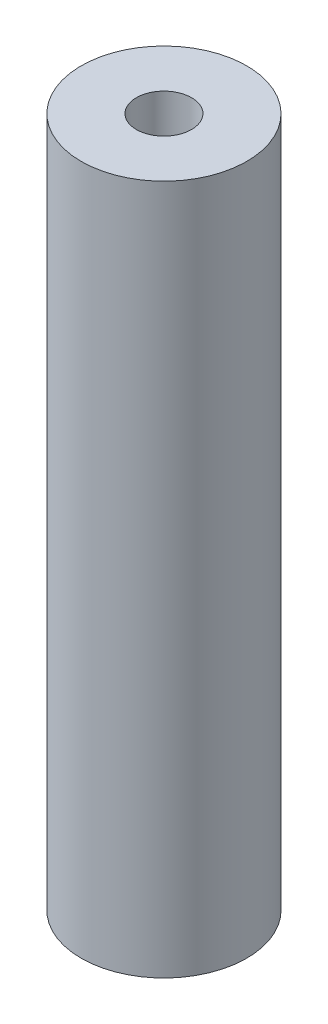
ISO-10303-21;
HEADER;
FILE_DESCRIPTION(('STEP AP214'),'2;1');
FILE_NAME('part.step','',(''),(''),'','','');
FILE_SCHEMA(('AUTOMOTIVE_DESIGN { 1 0 10303 214 1 1 1 1 }'));
ENDSEC;
DATA;
#1=APPLICATION_CONTEXT('core data for automotive mechanical design processes');
#2=APPLICATION_PROTOCOL_DEFINITION('international standard','automotive_design',2000,#1);
#3=PRODUCT_CONTEXT('',#1,'mechanical');
#4=PRODUCT('Part','Part','',(#3));
#5=PRODUCT_RELATED_PRODUCT_CATEGORY('part','',(#4));
#6=PRODUCT_DEFINITION_FORMATION('','',#4);
#7=PRODUCT_DEFINITION_CONTEXT('part definition',#1,'design');
#8=PRODUCT_DEFINITION('design','',#6,#7);
#9=PRODUCT_DEFINITION_SHAPE('','',#8);
#10=(LENGTH_UNIT() NAMED_UNIT(*) SI_UNIT(.MILLI.,.METRE.));
#11=(NAMED_UNIT(*) PLANE_ANGLE_UNIT() SI_UNIT($,.RADIAN.));
#12=(NAMED_UNIT(*) SI_UNIT($,.STERADIAN.) SOLID_ANGLE_UNIT());
#13=UNCERTAINTY_MEASURE_WITH_UNIT(LENGTH_MEASURE(1.E-05),#10,'distance_accuracy_value','');
#14=(GEOMETRIC_REPRESENTATION_CONTEXT(3) GLOBAL_UNCERTAINTY_ASSIGNED_CONTEXT((#13)) GLOBAL_UNIT_ASSIGNED_CONTEXT((#10,
#11,#12)) REPRESENTATION_CONTEXT('',''));
#15=CARTESIAN_POINT('',(0.,0.,0.));
#16=DIRECTION('',(0.,0.,1.));
#17=DIRECTION('',(1.,0.,0.));
#18=AXIS2_PLACEMENT_3D('',#15,#16,#17);
#19=CARTESIAN_POINT('',(0.,13.4683406425655,0.));
#20=DIRECTION('',(0.,1.,0.));
#21=DIRECTION('',(0.,0.,1.));
#22=AXIS2_PLACEMENT_3D('',#19,#20,#21);
#23=CYLINDRICAL_SURFACE('',#22,1.);
#24=CARTESIAN_POINT('',(0.,-11.5316593574345,0.));
#25=DIRECTION('',(0.,1.,0.));
#26=DIRECTION('',(0.,0.,1.));
#27=AXIS2_PLACEMENT_3D('',#24,#25,#26);
#28=CIRCLE('',#27,1.);
#29=CARTESIAN_POINT('',(0.,-11.5316593574345,1.));
#30=VERTEX_POINT('',#29);
#31=EDGE_CURVE('E44',#30,#30,#28,.T.);
#32=ORIENTED_EDGE('',*,*,#31,.F.);
#33=EDGE_LOOP('',(#32));
#34=FACE_BOUND('',#33,.T.);
#35=CARTESIAN_POINT('',(0.,13.4683406425655,0.));
#36=DIRECTION('',(0.,1.,0.));
#37=DIRECTION('',(0.,0.,1.));
#38=AXIS2_PLACEMENT_3D('',#35,#36,#37);
#39=CIRCLE('',#38,1.);
#40=CARTESIAN_POINT('',(0.,13.4683406425655,1.));
#41=VERTEX_POINT('',#40);
#42=EDGE_CURVE('E10',#41,#41,#39,.T.);
#43=ORIENTED_EDGE('',*,*,#42,.T.);
#44=EDGE_LOOP('',(#43));
#45=FACE_BOUND('',#44,.T.);
#46=ADVANCED_FACE('F30',(#34,#45),#23,.F.);
#47=CARTESIAN_POINT('',(0.,13.4683406425655,-1.));
#48=DIRECTION('',(0.,-1.,0.));
#49=DIRECTION('',(0.,0.,-1.));
#50=AXIS2_PLACEMENT_3D('',#47,#48,#49);
#51=PLANE('',#50);
#52=ORIENTED_EDGE('',*,*,#42,.F.);
#53=EDGE_LOOP('',(#52));
#54=FACE_BOUND('',#53,.T.);
#55=CARTESIAN_POINT('',(0.,13.4683406425655,0.));
#56=DIRECTION('',(0.,1.,0.));
#57=DIRECTION('',(0.,0.,1.));
#58=AXIS2_PLACEMENT_3D('',#55,#56,#57);
#59=CIRCLE('',#58,3.);
#60=CARTESIAN_POINT('',(0.,13.4683406425655,3.));
#61=VERTEX_POINT('',#60);
#62=EDGE_CURVE('E36',#61,#61,#59,.T.);
#63=ORIENTED_EDGE('',*,*,#62,.T.);
#64=EDGE_LOOP('',(#63));
#65=FACE_BOUND('',#64,.T.);
#66=ADVANCED_FACE('F53',(#54,#65),#51,.F.);
#67=CARTESIAN_POINT('',(0.,13.4683406425655,0.));
#68=DIRECTION('',(0.,1.,0.));
#69=DIRECTION('',(0.,0.,1.));
#70=AXIS2_PLACEMENT_3D('',#67,#68,#69);
#71=CYLINDRICAL_SURFACE('',#70,3.);
#72=ORIENTED_EDGE('',*,*,#62,.F.);
#73=EDGE_LOOP('',(#72));
#74=FACE_BOUND('',#73,.T.);
#75=CARTESIAN_POINT('',(0.,-11.5316593574345,0.));
#76=DIRECTION('',(0.,1.,0.));
#77=DIRECTION('',(0.,0.,1.));
#78=AXIS2_PLACEMENT_3D('',#75,#76,#77);
#79=CIRCLE('',#78,3.);
#80=CARTESIAN_POINT('',(0.,-11.5316593574345,3.));
#81=VERTEX_POINT('',#80);
#82=EDGE_CURVE('E40',#81,#81,#79,.T.);
#83=ORIENTED_EDGE('',*,*,#82,.T.);
#84=EDGE_LOOP('',(#83));
#85=FACE_BOUND('',#84,.T.);
#86=ADVANCED_FACE('F57',(#74,#85),#71,.T.);
#87=CARTESIAN_POINT('',(0.,-11.5316593574345,-3.));
#88=DIRECTION('',(0.,1.,0.));
#89=DIRECTION('',(0.,0.,1.));
#90=AXIS2_PLACEMENT_3D('',#87,#88,#89);
#91=PLANE('',#90);
#92=ORIENTED_EDGE('',*,*,#82,.F.);
#93=EDGE_LOOP('',(#92));
#94=FACE_BOUND('',#93,.T.);
#95=ORIENTED_EDGE('',*,*,#31,.T.);
#96=EDGE_LOOP('',(#95));
#97=FACE_BOUND('',#96,.T.);
#98=ADVANCED_FACE('F50',(#94,#97),#91,.F.);
#99=CLOSED_SHELL('',(#46,#66,#86,#98));
#100=MANIFOLD_SOLID_BREP('B2',#99);
#101=ADVANCED_BREP_SHAPE_REPRESENTATION('',(#18,#100),#14);
#102=SHAPE_DEFINITION_REPRESENTATION(#9,#101);
ENDSEC;
END-ISO-10303-21;
